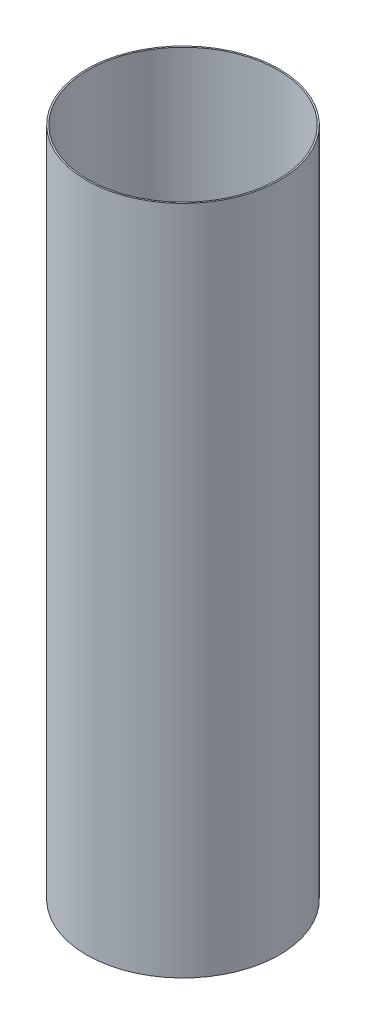
ISO-10303-21;
HEADER;
FILE_DESCRIPTION(('STEP AP214'),'2;1');
FILE_NAME('part.step','',(''),(''),'','','');
FILE_SCHEMA(('AUTOMOTIVE_DESIGN { 1 0 10303 214 1 1 1 1 }'));
ENDSEC;
DATA;
#1=APPLICATION_CONTEXT('core data for automotive mechanical design processes');
#2=APPLICATION_PROTOCOL_DEFINITION('international standard','automotive_design',2000,#1);
#3=PRODUCT_CONTEXT('',#1,'mechanical');
#4=PRODUCT('Part','Part','',(#3));
#5=PRODUCT_RELATED_PRODUCT_CATEGORY('part','',(#4));
#6=PRODUCT_DEFINITION_FORMATION('','',#4);
#7=PRODUCT_DEFINITION_CONTEXT('part definition',#1,'design');
#8=PRODUCT_DEFINITION('design','',#6,#7);
#9=PRODUCT_DEFINITION_SHAPE('','',#8);
#10=(LENGTH_UNIT() NAMED_UNIT(*) SI_UNIT(.MILLI.,.METRE.));
#11=(NAMED_UNIT(*) PLANE_ANGLE_UNIT() SI_UNIT($,.RADIAN.));
#12=(NAMED_UNIT(*) SI_UNIT($,.STERADIAN.) SOLID_ANGLE_UNIT());
#13=UNCERTAINTY_MEASURE_WITH_UNIT(LENGTH_MEASURE(1.E-05),#10,'distance_accuracy_value','');
#14=(GEOMETRIC_REPRESENTATION_CONTEXT(3) GLOBAL_UNCERTAINTY_ASSIGNED_CONTEXT((#13)) GLOBAL_UNIT_ASSIGNED_CONTEXT((#10,
#11,#12)) REPRESENTATION_CONTEXT('',''));
#15=CARTESIAN_POINT('',(0.,0.,0.));
#16=DIRECTION('',(0.,0.,1.));
#17=DIRECTION('',(1.,0.,0.));
#18=AXIS2_PLACEMENT_3D('',#15,#16,#17);
#19=CARTESIAN_POINT('',(0.,457.2,0.));
#20=DIRECTION('',(0.,1.,0.));
#21=DIRECTION('',(0.,0.,1.));
#22=AXIS2_PLACEMENT_3D('',#19,#20,#21);
#23=PLANE('',#22);
#24=CARTESIAN_POINT('',(0.,457.2,0.));
#25=DIRECTION('',(0.,1.,0.));
#26=DIRECTION('',(0.,0.,1.));
#27=AXIS2_PLACEMENT_3D('',#24,#25,#26);
#28=CIRCLE('',#27,65.7225);
#29=CARTESIAN_POINT('',(0.,457.2,65.7225));
#30=VERTEX_POINT('',#29);
#31=EDGE_CURVE('E10',#30,#30,#28,.T.);
#32=ORIENTED_EDGE('',*,*,#31,.T.);
#33=EDGE_LOOP('',(#32));
#34=FACE_BOUND('',#33,.T.);
#35=CARTESIAN_POINT('',(0.,457.2,0.));
#36=DIRECTION('',(0.,1.,0.));
#37=DIRECTION('',(0.,0.,1.));
#38=AXIS2_PLACEMENT_3D('',#35,#36,#37);
#39=CIRCLE('',#38,64.7065);
#40=CARTESIAN_POINT('',(0.,457.2,64.7065));
#41=VERTEX_POINT('',#40);
#42=EDGE_CURVE('E54',#41,#41,#39,.T.);
#43=ORIENTED_EDGE('',*,*,#42,.F.);
#44=EDGE_LOOP('',(#43));
#45=FACE_BOUND('',#44,.T.);
#46=ADVANCED_FACE('F41',(#34,#45),#23,.T.);
#47=CARTESIAN_POINT('',(0.,0.,0.));
#48=DIRECTION('',(0.,1.,0.));
#49=DIRECTION('',(0.,0.,1.));
#50=AXIS2_PLACEMENT_3D('',#47,#48,#49);
#51=PLANE('',#50);
#52=CARTESIAN_POINT('',(0.,0.,0.));
#53=DIRECTION('',(0.,1.,0.));
#54=DIRECTION('',(0.,0.,1.));
#55=AXIS2_PLACEMENT_3D('',#52,#53,#54);
#56=CIRCLE('',#55,65.7225);
#57=CARTESIAN_POINT('',(0.,0.,65.7225));
#58=VERTEX_POINT('',#57);
#59=EDGE_CURVE('E45',#58,#58,#56,.T.);
#60=ORIENTED_EDGE('',*,*,#59,.F.);
#61=EDGE_LOOP('',(#60));
#62=FACE_BOUND('',#61,.T.);
#63=CARTESIAN_POINT('',(0.,0.,0.));
#64=DIRECTION('',(0.,1.,0.));
#65=DIRECTION('',(0.,0.,1.));
#66=AXIS2_PLACEMENT_3D('',#63,#64,#65);
#67=CIRCLE('',#66,64.7065);
#68=CARTESIAN_POINT('',(0.,0.,64.7065));
#69=VERTEX_POINT('',#68);
#70=EDGE_CURVE('E56',#69,#69,#67,.T.);
#71=ORIENTED_EDGE('',*,*,#70,.T.);
#72=EDGE_LOOP('',(#71));
#73=FACE_BOUND('',#72,.T.);
#74=ADVANCED_FACE('F68',(#62,#73),#51,.F.);
#75=CARTESIAN_POINT('',(0.,457.2,0.));
#76=DIRECTION('',(0.,-1.,0.));
#77=DIRECTION('',(0.,0.,-1.));
#78=AXIS2_PLACEMENT_3D('',#75,#76,#77);
#79=CYLINDRICAL_SURFACE('',#78,65.7225);
#80=ORIENTED_EDGE('',*,*,#31,.F.);
#81=EDGE_LOOP('',(#80));
#82=FACE_BOUND('',#81,.T.);
#83=ORIENTED_EDGE('',*,*,#59,.T.);
#84=EDGE_LOOP('',(#83));
#85=FACE_BOUND('',#84,.T.);
#86=ADVANCED_FACE('F43',(#82,#85),#79,.T.);
#87=CARTESIAN_POINT('',(0.,457.2,0.));
#88=DIRECTION('',(0.,-1.,0.));
#89=DIRECTION('',(0.,0.,-1.));
#90=AXIS2_PLACEMENT_3D('',#87,#88,#89);
#91=CYLINDRICAL_SURFACE('',#90,64.7065);
#92=ORIENTED_EDGE('',*,*,#42,.T.);
#93=EDGE_LOOP('',(#92));
#94=FACE_BOUND('',#93,.T.);
#95=ORIENTED_EDGE('',*,*,#70,.F.);
#96=EDGE_LOOP('',(#95));
#97=FACE_BOUND('',#96,.T.);
#98=ADVANCED_FACE('F64',(#94,#97),#91,.F.);
#99=CLOSED_SHELL('',(#46,#74,#86,#98));
#100=MANIFOLD_SOLID_BREP('B2',#99);
#101=ADVANCED_BREP_SHAPE_REPRESENTATION('',(#18,#100),#14);
#102=SHAPE_DEFINITION_REPRESENTATION(#9,#101);
ENDSEC;
END-ISO-10303-21;
